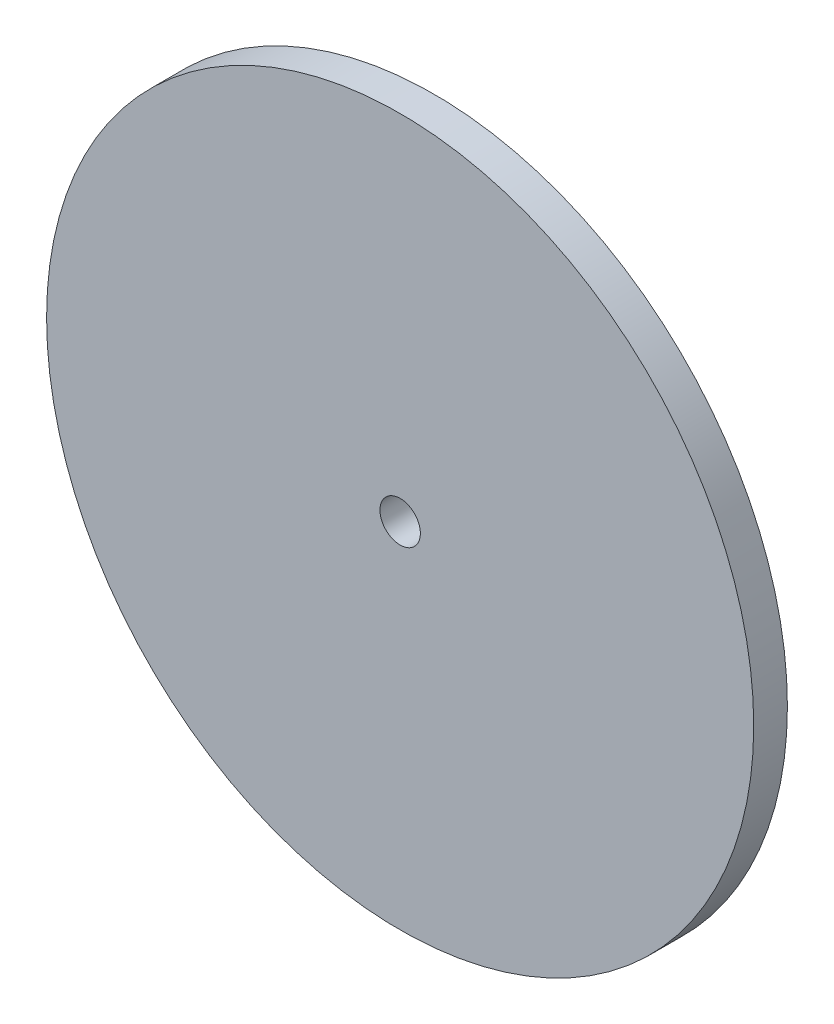
ISO-10303-21;
HEADER;
FILE_DESCRIPTION(('STEP AP214'),'2;1');
FILE_NAME('part.step','',(''),(''),'','','');
FILE_SCHEMA(('AUTOMOTIVE_DESIGN { 1 0 10303 214 1 1 1 1 }'));
ENDSEC;
DATA;
#1=APPLICATION_CONTEXT('core data for automotive mechanical design processes');
#2=APPLICATION_PROTOCOL_DEFINITION('international standard','automotive_design',2000,#1);
#3=PRODUCT_CONTEXT('',#1,'mechanical');
#4=PRODUCT('Part','Part','',(#3));
#5=PRODUCT_RELATED_PRODUCT_CATEGORY('part','',(#4));
#6=PRODUCT_DEFINITION_FORMATION('','',#4);
#7=PRODUCT_DEFINITION_CONTEXT('part definition',#1,'design');
#8=PRODUCT_DEFINITION('design','',#6,#7);
#9=PRODUCT_DEFINITION_SHAPE('','',#8);
#10=(LENGTH_UNIT() NAMED_UNIT(*) SI_UNIT(.MILLI.,.METRE.));
#11=(NAMED_UNIT(*) PLANE_ANGLE_UNIT() SI_UNIT($,.RADIAN.));
#12=(NAMED_UNIT(*) SI_UNIT($,.STERADIAN.) SOLID_ANGLE_UNIT());
#13=UNCERTAINTY_MEASURE_WITH_UNIT(LENGTH_MEASURE(1.E-05),#10,'distance_accuracy_value','');
#14=(GEOMETRIC_REPRESENTATION_CONTEXT(3) GLOBAL_UNCERTAINTY_ASSIGNED_CONTEXT((#13)) GLOBAL_UNIT_ASSIGNED_CONTEXT((#10,
#11,#12)) REPRESENTATION_CONTEXT('',''));
#15=CARTESIAN_POINT('',(0.,0.,0.));
#16=DIRECTION('',(0.,0.,1.));
#17=DIRECTION('',(1.,0.,0.));
#18=AXIS2_PLACEMENT_3D('',#15,#16,#17);
#19=CARTESIAN_POINT('',(0.,0.,11.1));
#20=DIRECTION('',(0.,0.,-1.));
#21=DIRECTION('',(-1.,0.,0.));
#22=AXIS2_PLACEMENT_3D('',#19,#20,#21);
#23=CYLINDRICAL_SURFACE('',#22,8.);
#24=CARTESIAN_POINT('',(0.,0.,0.));
#25=DIRECTION('',(0.,0.,1.));
#26=DIRECTION('',(1.,0.,0.));
#27=AXIS2_PLACEMENT_3D('',#24,#25,#26);
#28=CIRCLE('',#27,8.);
#29=CARTESIAN_POINT('',(8.,0.,0.));
#30=VERTEX_POINT('',#29);
#31=EDGE_CURVE('E33',#30,#30,#28,.T.);
#32=ORIENTED_EDGE('',*,*,#31,.T.);
#33=EDGE_LOOP('',(#32));
#34=FACE_BOUND('',#33,.T.);
#35=CARTESIAN_POINT('',(0.,0.,6.1));
#36=DIRECTION('',(0.,0.,1.));
#37=DIRECTION('',(1.,0.,0.));
#38=AXIS2_PLACEMENT_3D('',#35,#36,#37);
#39=CIRCLE('',#38,8.);
#40=CARTESIAN_POINT('',(8.,0.,6.1));
#41=VERTEX_POINT('',#40);
#42=EDGE_CURVE('E10',#41,#41,#39,.T.);
#43=ORIENTED_EDGE('',*,*,#42,.F.);
#44=EDGE_LOOP('',(#43));
#45=FACE_BOUND('',#44,.T.);
#46=ADVANCED_FACE('F30',(#34,#45),#23,.T.);
#47=CARTESIAN_POINT('',(0.,0.,11.1));
#48=DIRECTION('',(0.,0.,1.));
#49=DIRECTION('',(1.,0.,0.));
#50=AXIS2_PLACEMENT_3D('',#47,#48,#49);
#51=PLANE('',#50);
#52=CARTESIAN_POINT('',(0.,0.,11.1));
#53=DIRECTION('',(0.,0.,1.));
#54=DIRECTION('',(1.,0.,0.));
#55=AXIS2_PLACEMENT_3D('',#52,#53,#54);
#56=CIRCLE('',#55,3.);
#57=CARTESIAN_POINT('',(3.,0.,11.1));
#58=VERTEX_POINT('',#57);
#59=EDGE_CURVE('E41',#58,#58,#56,.T.);
#60=ORIENTED_EDGE('',*,*,#59,.F.);
#61=EDGE_LOOP('',(#60));
#62=FACE_BOUND('',#61,.T.);
#63=CARTESIAN_POINT('',(0.,0.,11.1));
#64=DIRECTION('',(0.,0.,1.));
#65=DIRECTION('',(1.,0.,0.));
#66=AXIS2_PLACEMENT_3D('',#63,#64,#65);
#67=CIRCLE('',#66,52.5);
#68=CARTESIAN_POINT('',(52.5,0.,11.1));
#69=VERTEX_POINT('',#68);
#70=EDGE_CURVE('E44',#69,#69,#67,.T.);
#71=ORIENTED_EDGE('',*,*,#70,.T.);
#72=EDGE_LOOP('',(#71));
#73=FACE_BOUND('',#72,.T.);
#74=ADVANCED_FACE('F58',(#62,#73),#51,.T.);
#75=CARTESIAN_POINT('',(0.,0.,0.));
#76=DIRECTION('',(0.,0.,1.));
#77=DIRECTION('',(1.,0.,0.));
#78=AXIS2_PLACEMENT_3D('',#75,#76,#77);
#79=PLANE('',#78);
#80=ORIENTED_EDGE('',*,*,#31,.F.);
#81=EDGE_LOOP('',(#80));
#82=FACE_BOUND('',#81,.T.);
#83=CARTESIAN_POINT('',(0.,0.,0.));
#84=DIRECTION('',(0.,0.,1.));
#85=DIRECTION('',(1.,0.,0.));
#86=AXIS2_PLACEMENT_3D('',#83,#84,#85);
#87=CIRCLE('',#86,3.);
#88=CARTESIAN_POINT('',(3.,0.,0.));
#89=VERTEX_POINT('',#88);
#90=EDGE_CURVE('E47',#89,#89,#87,.T.);
#91=ORIENTED_EDGE('',*,*,#90,.T.);
#92=EDGE_LOOP('',(#91));
#93=FACE_BOUND('',#92,.T.);
#94=ADVANCED_FACE('F76',(#82,#93),#79,.F.);
#95=CARTESIAN_POINT('',(0.,0.,11.1));
#96=DIRECTION('',(0.,0.,-1.));
#97=DIRECTION('',(-1.,0.,0.));
#98=AXIS2_PLACEMENT_3D('',#95,#96,#97);
#99=CYLINDRICAL_SURFACE('',#98,3.);
#100=ORIENTED_EDGE('',*,*,#59,.T.);
#101=EDGE_LOOP('',(#100));
#102=FACE_BOUND('',#101,.T.);
#103=ORIENTED_EDGE('',*,*,#90,.F.);
#104=EDGE_LOOP('',(#103));
#105=FACE_BOUND('',#104,.T.);
#106=ADVANCED_FACE('F67',(#102,#105),#99,.F.);
#107=CARTESIAN_POINT('',(0.,0.,6.1));
#108=DIRECTION('',(0.,0.,1.));
#109=DIRECTION('',(1.,0.,0.));
#110=AXIS2_PLACEMENT_3D('',#107,#108,#109);
#111=PLANE('',#110);
#112=CARTESIAN_POINT('',(0.,0.,6.1));
#113=DIRECTION('',(0.,0.,1.));
#114=DIRECTION('',(1.,0.,0.));
#115=AXIS2_PLACEMENT_3D('',#112,#113,#114);
#116=CIRCLE('',#115,52.5);
#117=CARTESIAN_POINT('',(52.5,0.,6.1));
#118=VERTEX_POINT('',#117);
#119=EDGE_CURVE('E49',#118,#118,#116,.T.);
#120=ORIENTED_EDGE('',*,*,#119,.F.);
#121=EDGE_LOOP('',(#120));
#122=FACE_BOUND('',#121,.T.);
#123=ORIENTED_EDGE('',*,*,#42,.T.);
#124=EDGE_LOOP('',(#123));
#125=FACE_BOUND('',#124,.T.);
#126=ADVANCED_FACE('F62',(#122,#125),#111,.F.);
#127=CARTESIAN_POINT('',(0.,0.,6.1));
#128=DIRECTION('',(0.,0.,1.));
#129=DIRECTION('',(1.,0.,0.));
#130=AXIS2_PLACEMENT_3D('',#127,#128,#129);
#131=CYLINDRICAL_SURFACE('',#130,52.5);
#132=ORIENTED_EDGE('',*,*,#119,.T.);
#133=EDGE_LOOP('',(#132));
#134=FACE_BOUND('',#133,.T.);
#135=ORIENTED_EDGE('',*,*,#70,.F.);
#136=EDGE_LOOP('',(#135));
#137=FACE_BOUND('',#136,.T.);
#138=ADVANCED_FACE('F60',(#134,#137),#131,.T.);
#139=CLOSED_SHELL('',(#46,#74,#94,#106,#126,#138));
#140=MANIFOLD_SOLID_BREP('B2',#139);
#141=ADVANCED_BREP_SHAPE_REPRESENTATION('',(#18,#140),#14);
#142=SHAPE_DEFINITION_REPRESENTATION(#9,#141);
ENDSEC;
END-ISO-10303-21;
